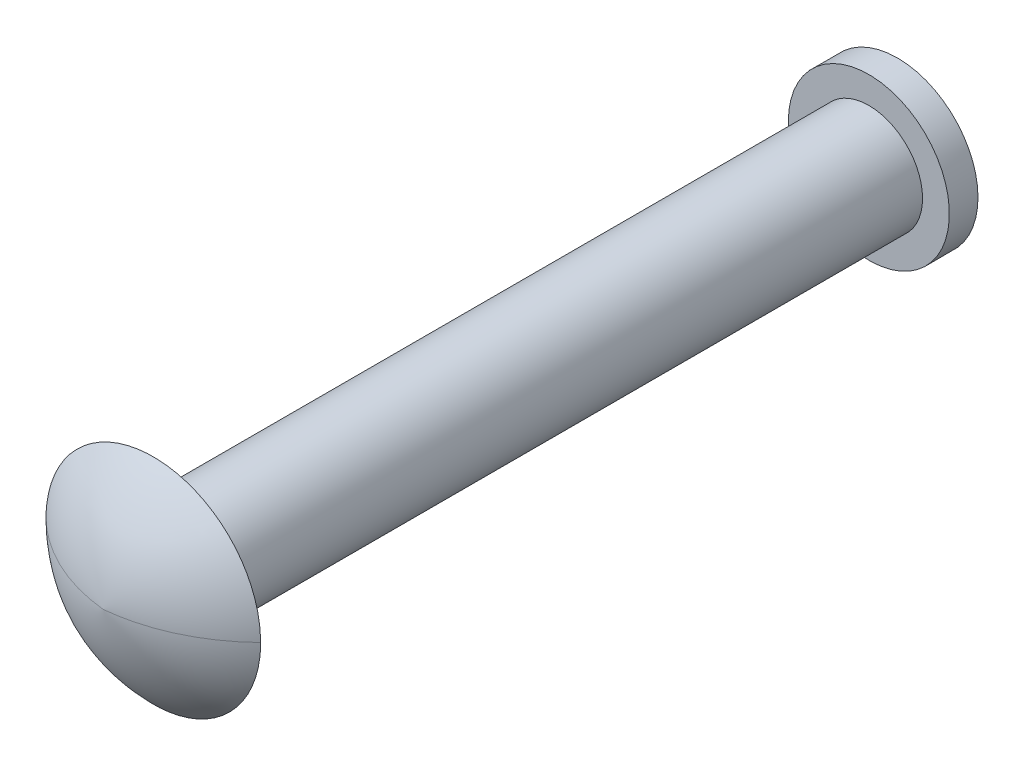
ISO-10303-21;
HEADER;
FILE_DESCRIPTION(('STEP AP214'),'2;1');
FILE_NAME('part.step','',(''),(''),'','','');
FILE_SCHEMA(('AUTOMOTIVE_DESIGN { 1 0 10303 214 1 1 1 1 }'));
ENDSEC;
DATA;
#1=APPLICATION_CONTEXT('core data for automotive mechanical design processes');
#2=APPLICATION_PROTOCOL_DEFINITION('international standard','automotive_design',2000,#1);
#3=PRODUCT_CONTEXT('',#1,'mechanical');
#4=PRODUCT('Part','Part','',(#3));
#5=PRODUCT_RELATED_PRODUCT_CATEGORY('part','',(#4));
#6=PRODUCT_DEFINITION_FORMATION('','',#4);
#7=PRODUCT_DEFINITION_CONTEXT('part definition',#1,'design');
#8=PRODUCT_DEFINITION('design','',#6,#7);
#9=PRODUCT_DEFINITION_SHAPE('','',#8);
#10=(LENGTH_UNIT() NAMED_UNIT(*) SI_UNIT(.MILLI.,.METRE.));
#11=(NAMED_UNIT(*) PLANE_ANGLE_UNIT() SI_UNIT($,.RADIAN.));
#12=(NAMED_UNIT(*) SI_UNIT($,.STERADIAN.) SOLID_ANGLE_UNIT());
#13=UNCERTAINTY_MEASURE_WITH_UNIT(LENGTH_MEASURE(1.E-05),#10,'distance_accuracy_value','');
#14=(GEOMETRIC_REPRESENTATION_CONTEXT(3) GLOBAL_UNCERTAINTY_ASSIGNED_CONTEXT((#13)) GLOBAL_UNIT_ASSIGNED_CONTEXT((#10,
#11,#12)) REPRESENTATION_CONTEXT('',''));
#15=CARTESIAN_POINT('',(0.,0.,0.));
#16=DIRECTION('',(0.,0.,1.));
#17=DIRECTION('',(1.,0.,0.));
#18=AXIS2_PLACEMENT_3D('',#15,#16,#17);
#19=CARTESIAN_POINT('',(-2.25,-2.25,-10.8));
#20=DIRECTION('',(0.,0.,-1.));
#21=DIRECTION('',(0.,1.,0.));
#22=AXIS2_PLACEMENT_3D('',#19,#20,#21);
#23=PLANE('',#22);
#24=CARTESIAN_POINT('',(0.,0.,-10.8));
#25=DIRECTION('',(0.,0.,-1.));
#26=DIRECTION('',(1.,0.,0.));
#27=AXIS2_PLACEMENT_3D('',#24,#25,#26);
#28=CIRCLE('',#27,2.25);
#29=CARTESIAN_POINT('',(2.25,0.,-10.8));
#30=VERTEX_POINT('',#29);
#31=EDGE_CURVE('E151',#30,#30,#28,.F.);
#32=ORIENTED_EDGE('',*,*,#31,.F.);
#33=EDGE_LOOP('',(#32));
#34=FACE_BOUND('',#33,.T.);
#35=ADVANCED_FACE('F17',(#34),#23,.T.);
#36=CARTESIAN_POINT('',(2.25,-2.25,-10.));
#37=DIRECTION('',(0.,0.,1.));
#38=DIRECTION('',(0.,1.,0.));
#39=AXIS2_PLACEMENT_3D('',#36,#37,#38);
#40=PLANE('',#39);
#41=CARTESIAN_POINT('',(0.,0.,-10.));
#42=DIRECTION('',(0.,0.,1.));
#43=DIRECTION('',(-1.,0.,0.));
#44=AXIS2_PLACEMENT_3D('',#41,#42,#43);
#45=CIRCLE('',#44,2.25);
#46=CARTESIAN_POINT('',(-2.25,0.,-10.));
#47=VERTEX_POINT('',#46);
#48=EDGE_CURVE('E153',#47,#47,#45,.T.);
#49=ORIENTED_EDGE('',*,*,#48,.T.);
#50=EDGE_LOOP('',(#49));
#51=FACE_BOUND('',#50,.T.);
#52=CARTESIAN_POINT('',(0.,0.,-10.));
#53=DIRECTION('',(0.,0.,-1.));
#54=DIRECTION('',(1.,0.,0.));
#55=AXIS2_PLACEMENT_3D('',#52,#53,#54);
#56=CIRCLE('',#55,1.5);
#57=CARTESIAN_POINT('',(1.5,0.,-10.));
#58=VERTEX_POINT('',#57);
#59=EDGE_CURVE('E55',#58,#58,#56,.F.);
#60=ORIENTED_EDGE('',*,*,#59,.F.);
#61=EDGE_LOOP('',(#60));
#62=FACE_BOUND('',#61,.T.);
#63=ADVANCED_FACE('F125',(#51,#62),#40,.T.);
#64=CARTESIAN_POINT('',(-3.,-3.,10.));
#65=DIRECTION('',(0.,0.,-1.));
#66=DIRECTION('',(0.,1.,0.));
#67=AXIS2_PLACEMENT_3D('',#64,#65,#66);
#68=PLANE('',#67);
#69=CARTESIAN_POINT('',(3.,0.,10.));
#70=CARTESIAN_POINT('',(3.00000020284646,0.0491468463204253,10.));
#71=CARTESIAN_POINT('',(2.99880764241094,0.0982935130380294,10.));
#72=CARTESIAN_POINT('',(2.99404098853956,0.196565765477887,10.));
#73=CARTESIAN_POINT('',(2.99046233086989,0.245691129895635,10.));
#74=CARTESIAN_POINT('',(2.98092156761264,0.343771929240707,10.));
#75=CARTESIAN_POINT('',(2.97495648556987,0.392727074660294,10.));
#76=CARTESIAN_POINT('',(2.96064909919153,0.490323435182134,10.));
#77=CARTESIAN_POINT('',(2.95230515267095,0.538964409601162,10.));
#78=CARTESIAN_POINT('',(2.9332537469775,0.635793167089272,10.));
#79=CARTESIAN_POINT('',(2.92254573702436,0.683980841816246,10.));
#80=CARTESIAN_POINT('',(2.89878724086213,0.779768551579843,10.));
#81=CARTESIAN_POINT('',(2.88573706641552,0.827368663925969,10.));
#82=CARTESIAN_POINT('',(2.85732230922858,0.921851633698927,10.));
#83=CARTESIAN_POINT('',(2.84195868853992,0.96873478039177,10.));
#84=CARTESIAN_POINT('',(2.80895187640743,1.06165906703895,10.));
#85=CARTESIAN_POINT('',(2.79131010424928,1.10770071103127,10.));
#86=CARTESIAN_POINT('',(2.75378832181262,1.19882212692325,10.));
#87=CARTESIAN_POINT('',(2.73391001645548,1.24390260075932,10.));
#88=CARTESIAN_POINT('',(2.69196272109963,1.33298671744783,10.));
#89=CARTESIAN_POINT('',(2.66989557328385,1.37699122761831,10.));
#90=CARTESIAN_POINT('',(2.62362409058598,1.46381338002381,10.));
#91=CARTESIAN_POINT('',(2.59942161113841,1.50663201099821,10.));
#92=CARTESIAN_POINT('',(2.54893862919822,1.59097730112834,10.));
#93=CARTESIAN_POINT('',(2.52265989615926,1.63250501926406,10.));
#94=CARTESIAN_POINT('',(2.46808895950898,1.71416831959704,10.));
#95=CARTESIAN_POINT('',(2.43979836455643,1.75430497670765,10.));
#96=CARTESIAN_POINT('',(2.3812733675554,1.83309093308115,10.));
#97=CARTESIAN_POINT('',(2.35104036185058,1.87174126956219,10.));
#98=CARTESIAN_POINT('',(2.28870504171117,1.94746430350281,10.));
#99=CARTESIAN_POINT('',(2.25660388124789,1.98453795090202,10.));
#100=CARTESIAN_POINT('',(2.19061131079851,2.05702226133107,10.));
#101=CARTESIAN_POINT('',(2.15672080138521,2.09243374428514,10.));
#102=CARTESIAN_POINT('',(2.08723288170225,2.16151330856904,10.));
#103=CARTESIAN_POINT('',(2.05163612371979,2.1951820460606,10.));
#104=CARTESIAN_POINT('',(1.97882307675932,2.26070062040195,10.));
#105=CARTESIAN_POINT('',(1.94160720984529,2.29255092632776,10.));
#106=CARTESIAN_POINT('',(1.86564707120101,2.35436204552287,10.));
#107=CARTESIAN_POINT('',(1.82690301900757,2.38432312859965,10.));
#108=CARTESIAN_POINT('',(1.74798113090909,2.44229010521479,10.));
#109=CARTESIAN_POINT('',(1.7078033460673,2.4702960682811,10.));
#110=CARTESIAN_POINT('',(1.62611185071513,2.52429199132167,10.));
#111=CARTESIAN_POINT('',(1.58459806011786,2.55028183011964,10.));
#112=CARTESIAN_POINT('',(1.50033539342938,2.60018956328296,10.));
#113=CARTESIAN_POINT('',(1.45758634391866,2.62410716482126,10.));
#114=CARTESIAN_POINT('',(1.3709567297361,2.66981934443358,10.));
#115=CARTESIAN_POINT('',(1.3270759342525,2.69161348504258,10.));
#116=CARTESIAN_POINT('',(1.23828887904027,2.73303251778442,9.99999999999999));
#117=CARTESIAN_POINT('',(1.19338236326412,2.75265686097618,9.99999999999999));
#118=CARTESIAN_POINT('',(1.1026521513009,2.78969492149854,10.));
#119=CARTESIAN_POINT('',(1.0568282007898,2.80710801573956,10.));
#120=CARTESIAN_POINT('',(0.96437338984183,2.8396870442669,10.));
#121=CARTESIAN_POINT('',(0.917742297647335,2.85485232076168,10.));
#122=CARTESIAN_POINT('',(0.823785215093992,2.88290402076812,10.));
#123=CARTESIAN_POINT('',(0.776459029823575,2.89578979133897,9.99999999999999));
#124=CARTESIAN_POINT('',(0.681225269194332,2.91925562737246,9.99999999999999));
#125=CARTESIAN_POINT('',(0.633317543472669,2.92983508250641,10.));
#126=CARTESIAN_POINT('',(0.53703546134663,2.94866627822327,10.));
#127=CARTESIAN_POINT('',(0.488661000622414,2.95691748534247,10.));
#128=CARTESIAN_POINT('',(0.391561213836587,2.97107502180271,10.));
#129=CARTESIAN_POINT('',(0.34283582547708,2.97698092380141,10.));
#130=CARTESIAN_POINT('',(0.24515070858709,2.98643553806352,10.));
#131=CARTESIAN_POINT('',(0.196190951201238,2.98998395214296,10.));
#132=CARTESIAN_POINT('',(0.0981541341374786,2.99471613618716,10.));
#133=CARTESIAN_POINT('',(0.0490770670687403,2.99589975300985,10.));
#134=CARTESIAN_POINT('',(-0.0490770670687369,2.99589975300985,10.));
#135=CARTESIAN_POINT('',(-0.0981541341374756,2.99471613618716,10.));
#136=CARTESIAN_POINT('',(-0.196190951201236,2.98998395214296,10.));
#137=CARTESIAN_POINT('',(-0.245150708587088,2.98643553806352,10.));
#138=CARTESIAN_POINT('',(-0.342835825477078,2.97698092380142,10.));
#139=CARTESIAN_POINT('',(-0.391561213836583,2.97107502180271,10.));
#140=CARTESIAN_POINT('',(-0.488661000622411,2.95691748534247,10.));
#141=CARTESIAN_POINT('',(-0.537035461346627,2.94866627822327,10.));
#142=CARTESIAN_POINT('',(-0.633317543472667,2.92983508250641,10.));
#143=CARTESIAN_POINT('',(-0.68122526919433,2.91925562737246,10.));
#144=CARTESIAN_POINT('',(-0.776459029823573,2.89578979133897,10.));
#145=CARTESIAN_POINT('',(-0.823785215093989,2.88290402076812,10.));
#146=CARTESIAN_POINT('',(-0.917742297647332,2.85485232076168,10.));
#147=CARTESIAN_POINT('',(-0.964373389841827,2.8396870442669,10.));
#148=CARTESIAN_POINT('',(-1.0568282007898,2.80710801573956,10.));
#149=CARTESIAN_POINT('',(-1.1026521513009,2.78969492149854,10.));
#150=CARTESIAN_POINT('',(-1.19338236326412,2.75265686097618,10.));
#151=CARTESIAN_POINT('',(-1.23828887904027,2.73303251778442,10.));
#152=CARTESIAN_POINT('',(-1.32707593425249,2.69161348504258,10.));
#153=CARTESIAN_POINT('',(-1.3709567297361,2.66981934443358,10.));
#154=CARTESIAN_POINT('',(-1.45758634391866,2.62410716482126,10.));
#155=CARTESIAN_POINT('',(-1.50033539342938,2.60018956328296,10.));
#156=CARTESIAN_POINT('',(-1.58459806011786,2.55028183011964,10.));
#157=CARTESIAN_POINT('',(-1.62611185071513,2.52429199132167,10.));
#158=CARTESIAN_POINT('',(-1.7078033460673,2.4702960682811,10.));
#159=CARTESIAN_POINT('',(-1.74798113090909,2.44229010521479,10.));
#160=CARTESIAN_POINT('',(-1.82690301900757,2.38432312859965,10.));
#161=CARTESIAN_POINT('',(-1.865647071201,2.35436204552287,10.));
#162=CARTESIAN_POINT('',(-1.94160720984529,2.29255092632776,10.));
#163=CARTESIAN_POINT('',(-1.97882307675932,2.26070062040194,10.));
#164=CARTESIAN_POINT('',(-2.05163612371979,2.1951820460606,10.));
#165=CARTESIAN_POINT('',(-2.08723288170225,2.16151330856904,10.));
#166=CARTESIAN_POINT('',(-2.15672080138521,2.09243374428513,10.));
#167=CARTESIAN_POINT('',(-2.19061131079851,2.05702226133107,10.));
#168=CARTESIAN_POINT('',(-2.25660388124789,1.98453795090201,10.));
#169=CARTESIAN_POINT('',(-2.28870504171117,1.94746430350281,10.));
#170=CARTESIAN_POINT('',(-2.35104036185057,1.87174126956219,10.));
#171=CARTESIAN_POINT('',(-2.3812733675554,1.83309093308115,10.));
#172=CARTESIAN_POINT('',(-2.43979836455643,1.75430497670765,10.));
#173=CARTESIAN_POINT('',(-2.46808895950897,1.71416831959704,10.));
#174=CARTESIAN_POINT('',(-2.52265989615926,1.63250501926406,10.));
#175=CARTESIAN_POINT('',(-2.54893862919822,1.59097730112833,10.));
#176=CARTESIAN_POINT('',(-2.59942161113841,1.5066320109982,10.));
#177=CARTESIAN_POINT('',(-2.62362409058598,1.46381338002381,9.99999999999999));
#178=CARTESIAN_POINT('',(-2.66989557328385,1.3769912276183,9.99999999999999));
#179=CARTESIAN_POINT('',(-2.69196272109963,1.33298671744783,10.));
#180=CARTESIAN_POINT('',(-2.73391001645548,1.24390260075932,10.));
#181=CARTESIAN_POINT('',(-2.75378832181262,1.19882212692325,10.));
#182=CARTESIAN_POINT('',(-2.79131010424928,1.10770071103127,10.));
#183=CARTESIAN_POINT('',(-2.80895187640743,1.06165906703894,10.));
#184=CARTESIAN_POINT('',(-2.84195868853992,0.968734780391763,10.));
#185=CARTESIAN_POINT('',(-2.85732230922858,0.92185163369892,10.));
#186=CARTESIAN_POINT('',(-2.88573706641552,0.827368663925962,10.));
#187=CARTESIAN_POINT('',(-2.89878724086213,0.779768551579836,10.));
#188=CARTESIAN_POINT('',(-2.92254573702436,0.683980841816238,10.));
#189=CARTESIAN_POINT('',(-2.9332537469775,0.635793167089264,10.));
#190=CARTESIAN_POINT('',(-2.95230515267095,0.538964409601153,10.));
#191=CARTESIAN_POINT('',(-2.96064909919153,0.490323435182125,10.));
#192=CARTESIAN_POINT('',(-2.97495648556987,0.392727074660285,10.));
#193=CARTESIAN_POINT('',(-2.98092156761264,0.343771929240698,10.));
#194=CARTESIAN_POINT('',(-2.99046233086989,0.245691129895626,10.));
#195=CARTESIAN_POINT('',(-2.99404098853956,0.196565765477879,10.));
#196=CARTESIAN_POINT('',(-2.99880764241094,0.0982935130380203,10.));
#197=CARTESIAN_POINT('',(-3.00000020284646,0.0491468463204161,10.));
#198=CARTESIAN_POINT('',(-2.99999999999999,0.,10.));
#199=B_SPLINE_CURVE_WITH_KNOTS('',3,(#69,#70,#71,#72,#73,#74,#75,#76,#77,#78,#79,#80,#81,#82,
#83,#84,#85,#86,#87,#88,#89,#90,#91,#92,#93,#94,#95,#96,#97,#98,#99,#100,#101,#102,#103,#104,
#105,#106,#107,#108,#109,#110,#111,#112,#113,#114,#115,#116,#117,#118,#119,#120,#121,#122,#123,
#124,#125,#126,#127,#128,#129,#130,#131,#132,#133,#134,#135,#136,#137,#138,#139,#140,#141,#142,
#143,#144,#145,#146,#147,#148,#149,#150,#151,#152,#153,#154,#155,#156,#157,#158,#159,#160,#161,
#162,#163,#164,#165,#166,#167,#168,#169,#170,#171,#172,#173,#174,#175,#176,#177,#178,#179,#180,
#181,#182,#183,#184,#185,#186,#187,#188,#189,#190,#191,#192,#193,#194,#195,#196,#197,#198),
.UNSPECIFIED.,.F.,.F.,(4,2,2,2,2,2,2,2,2,2,2,2,2,2,2,2,2,2,2,2,2,2,2,2,2,2,2,2,2,2,2,2,2,2,2,2,
2,2,2,2,2,2,2,2,2,2,2,2,2,2,2,2,2,2,2,2,2,2,2,2,2,2,2,2,4),(0.,0.147425867713881,
0.295134550379822,0.443028039153769,0.591023870449802,0.739054218317639,0.887064876652057,
1.03501415355226,1.18287169893794,1.33061728577323,1.47823956472878,1.62573481164507,
1.77310568660213,1.92036002264679,2.06750966120472,2.21456934987737,2.36155571668913,
2.5084863329349,2.65537887463318,2.80225039028237,2.94911668022552,3.09599179053082,
3.24288762196673,3.38981365245681,3.53677676939175,3.68378120638939,3.83082857754813,
3.97791800093872,4.1250463020159,4.27220828678662,4.41939707392065,4.5666044745048,
4.7138214077949,4.86103834108501,5.00824574166916,5.15543452880319,5.3025965135739,
5.44972481465109,5.59681423804168,5.74386160920042,5.89086604619806,6.037829163133,
6.18475519362308,6.33165102505899,6.4785261353643,6.62539242530745,6.77226394095663,
6.91915648265491,7.06608709890068,7.21307346571245,7.36013315438509,7.50728279294302,
7.65453712898768,7.80190800394474,7.94940325086103,8.09702552981659,8.24477111665187,
8.39262866203756,8.54057793893776,8.68858859727218,8.83661894514002,8.98461477643605,
9.13250826521,9.28021694787594,9.42764281558982),.UNSPECIFIED.);
#200=CARTESIAN_POINT('',(3.,0.,10.));
#201=VERTEX_POINT('',#200);
#202=CARTESIAN_POINT('',(-3.,0.,10.));
#203=VERTEX_POINT('',#202);
#204=EDGE_CURVE('E42',#201,#203,#199,.T.);
#205=ORIENTED_EDGE('',*,*,#204,.F.);
#206=CARTESIAN_POINT('',(-3.,0.,10.));
#207=CARTESIAN_POINT('',(-3.00000020284646,-0.049146846320425,10.));
#208=CARTESIAN_POINT('',(-2.99880764241094,-0.0982935130380291,10.));
#209=CARTESIAN_POINT('',(-2.99404098853956,-0.196565765477887,10.));
#210=CARTESIAN_POINT('',(-2.99046233086989,-0.245691129895635,10.));
#211=CARTESIAN_POINT('',(-2.98092156761264,-0.343771929240707,10.));
#212=CARTESIAN_POINT('',(-2.97495648556987,-0.392727074660294,10.));
#213=CARTESIAN_POINT('',(-2.96064909919153,-0.490323435182133,10.));
#214=CARTESIAN_POINT('',(-2.95230515267095,-0.538964409601161,10.));
#215=CARTESIAN_POINT('',(-2.9332537469775,-0.635793167089272,10.));
#216=CARTESIAN_POINT('',(-2.92254573702436,-0.683980841816245,10.));
#217=CARTESIAN_POINT('',(-2.89878724086213,-0.779768551579843,10.));
#218=CARTESIAN_POINT('',(-2.88573706641552,-0.827368663925968,10.));
#219=CARTESIAN_POINT('',(-2.85732230922858,-0.921851633698927,10.));
#220=CARTESIAN_POINT('',(-2.84195868853992,-0.96873478039177,10.));
#221=CARTESIAN_POINT('',(-2.80895187640743,-1.06165906703895,10.));
#222=CARTESIAN_POINT('',(-2.79131010424928,-1.10770071103127,10.));
#223=CARTESIAN_POINT('',(-2.75378832181262,-1.19882212692325,10.));
#224=CARTESIAN_POINT('',(-2.73391001645548,-1.24390260075932,10.));
#225=CARTESIAN_POINT('',(-2.69196272109963,-1.33298671744783,10.));
#226=CARTESIAN_POINT('',(-2.66989557328385,-1.37699122761831,10.));
#227=CARTESIAN_POINT('',(-2.62362409058598,-1.46381338002381,10.));
#228=CARTESIAN_POINT('',(-2.59942161113841,-1.50663201099821,10.));
#229=CARTESIAN_POINT('',(-2.54893862919822,-1.59097730112834,10.));
#230=CARTESIAN_POINT('',(-2.52265989615926,-1.63250501926406,10.));
#231=CARTESIAN_POINT('',(-2.46808895950898,-1.71416831959704,10.));
#232=CARTESIAN_POINT('',(-2.43979836455643,-1.75430497670765,10.));
#233=CARTESIAN_POINT('',(-2.3812733675554,-1.83309093308115,10.));
#234=CARTESIAN_POINT('',(-2.35104036185058,-1.87174126956219,10.));
#235=CARTESIAN_POINT('',(-2.28870504171117,-1.94746430350281,10.));
#236=CARTESIAN_POINT('',(-2.25660388124789,-1.98453795090202,10.));
#237=CARTESIAN_POINT('',(-2.19061131079851,-2.05702226133108,10.));
#238=CARTESIAN_POINT('',(-2.15672080138521,-2.09243374428514,10.));
#239=CARTESIAN_POINT('',(-2.08723288170225,-2.16151330856904,10.));
#240=CARTESIAN_POINT('',(-2.05163612371979,-2.1951820460606,10.));
#241=CARTESIAN_POINT('',(-1.97882307675932,-2.26070062040194,10.));
#242=CARTESIAN_POINT('',(-1.94160720984529,-2.29255092632776,10.));
#243=CARTESIAN_POINT('',(-1.86564707120101,-2.35436204552287,10.));
#244=CARTESIAN_POINT('',(-1.82690301900757,-2.38432312859965,10.));
#245=CARTESIAN_POINT('',(-1.74798113090909,-2.44229010521479,10.));
#246=CARTESIAN_POINT('',(-1.7078033460673,-2.4702960682811,10.));
#247=CARTESIAN_POINT('',(-1.62611185071513,-2.52429199132167,10.));
#248=CARTESIAN_POINT('',(-1.58459806011786,-2.55028183011964,10.));
#249=CARTESIAN_POINT('',(-1.50033539342938,-2.60018956328297,10.));
#250=CARTESIAN_POINT('',(-1.45758634391866,-2.62410716482126,10.));
#251=CARTESIAN_POINT('',(-1.3709567297361,-2.66981934443358,10.));
#252=CARTESIAN_POINT('',(-1.3270759342525,-2.69161348504258,10.));
#253=CARTESIAN_POINT('',(-1.23828887904027,-2.73303251778442,9.99999999999999));
#254=CARTESIAN_POINT('',(-1.19338236326412,-2.75265686097619,9.99999999999999));
#255=CARTESIAN_POINT('',(-1.1026521513009,-2.78969492149854,9.99999999999999));
#256=CARTESIAN_POINT('',(-1.0568282007898,-2.80710801573956,10.));
#257=CARTESIAN_POINT('',(-0.96437338984183,-2.8396870442669,10.));
#258=CARTESIAN_POINT('',(-0.917742297647336,-2.85485232076168,10.));
#259=CARTESIAN_POINT('',(-0.823785215093992,-2.88290402076812,10.));
#260=CARTESIAN_POINT('',(-0.776459029823575,-2.89578979133897,9.99999999999999));
#261=CARTESIAN_POINT('',(-0.681225269194333,-2.91925562737246,9.99999999999999));
#262=CARTESIAN_POINT('',(-0.633317543472671,-2.92983508250641,10.));
#263=CARTESIAN_POINT('',(-0.537035461346631,-2.94866627822327,10.));
#264=CARTESIAN_POINT('',(-0.488661000622415,-2.95691748534247,10.));
#265=CARTESIAN_POINT('',(-0.391561213836587,-2.97107502180271,10.));
#266=CARTESIAN_POINT('',(-0.342835825477081,-2.97698092380142,10.));
#267=CARTESIAN_POINT('',(-0.245150708587091,-2.98643553806352,10.));
#268=CARTESIAN_POINT('',(-0.19619095120124,-2.98998395214296,10.));
#269=CARTESIAN_POINT('',(-0.0981541341374798,-2.99471613618716,10.));
#270=CARTESIAN_POINT('',(-0.0490770670687411,-2.99589975300985,10.));
#271=CARTESIAN_POINT('',(0.0490770670687364,-2.99589975300985,10.));
#272=CARTESIAN_POINT('',(0.0981541341374752,-2.99471613618716,10.));
#273=CARTESIAN_POINT('',(0.196190951201235,-2.98998395214296,10.));
#274=CARTESIAN_POINT('',(0.245150708587087,-2.98643553806352,10.));
#275=CARTESIAN_POINT('',(0.342835825477076,-2.97698092380142,10.));
#276=CARTESIAN_POINT('',(0.391561213836582,-2.97107502180271,10.));
#277=CARTESIAN_POINT('',(0.488661000622411,-2.95691748534247,10.));
#278=CARTESIAN_POINT('',(0.537035461346627,-2.94866627822327,10.));
#279=CARTESIAN_POINT('',(0.633317543472666,-2.92983508250641,10.));
#280=CARTESIAN_POINT('',(0.681225269194329,-2.91925562737246,10.));
#281=CARTESIAN_POINT('',(0.776459029823572,-2.89578979133897,10.));
#282=CARTESIAN_POINT('',(0.823785215093989,-2.88290402076812,10.));
#283=CARTESIAN_POINT('',(0.917742297647332,-2.85485232076168,10.));
#284=CARTESIAN_POINT('',(0.964373389841826,-2.8396870442669,10.));
#285=CARTESIAN_POINT('',(1.0568282007898,-2.80710801573956,10.));
#286=CARTESIAN_POINT('',(1.10265215130089,-2.78969492149854,10.));
#287=CARTESIAN_POINT('',(1.19338236326412,-2.75265686097619,10.));
#288=CARTESIAN_POINT('',(1.23828887904027,-2.73303251778442,10.));
#289=CARTESIAN_POINT('',(1.32707593425249,-2.69161348504258,10.));
#290=CARTESIAN_POINT('',(1.3709567297361,-2.66981934443358,10.));
#291=CARTESIAN_POINT('',(1.45758634391866,-2.62410716482126,10.));
#292=CARTESIAN_POINT('',(1.50033539342938,-2.60018956328297,10.));
#293=CARTESIAN_POINT('',(1.58459806011786,-2.55028183011964,10.));
#294=CARTESIAN_POINT('',(1.62611185071513,-2.52429199132167,10.));
#295=CARTESIAN_POINT('',(1.7078033460673,-2.4702960682811,10.));
#296=CARTESIAN_POINT('',(1.74798113090909,-2.44229010521479,10.));
#297=CARTESIAN_POINT('',(1.82690301900757,-2.38432312859965,10.));
#298=CARTESIAN_POINT('',(1.86564707120101,-2.35436204552287,10.));
#299=CARTESIAN_POINT('',(1.94160720984529,-2.29255092632776,10.));
#300=CARTESIAN_POINT('',(1.97882307675932,-2.26070062040194,10.));
#301=CARTESIAN_POINT('',(2.05163612371979,-2.1951820460606,10.));
#302=CARTESIAN_POINT('',(2.08723288170225,-2.16151330856904,10.));
#303=CARTESIAN_POINT('',(2.15672080138522,-2.09243374428514,10.));
#304=CARTESIAN_POINT('',(2.19061131079851,-2.05702226133107,10.));
#305=CARTESIAN_POINT('',(2.25660388124789,-1.98453795090201,10.));
#306=CARTESIAN_POINT('',(2.28870504171117,-1.94746430350281,10.));
#307=CARTESIAN_POINT('',(2.35104036185058,-1.87174126956219,10.));
#308=CARTESIAN_POINT('',(2.3812733675554,-1.83309093308115,10.));
#309=CARTESIAN_POINT('',(2.43979836455643,-1.75430497670765,10.));
#310=CARTESIAN_POINT('',(2.46808895950898,-1.71416831959704,10.));
#311=CARTESIAN_POINT('',(2.52265989615926,-1.63250501926406,10.));
#312=CARTESIAN_POINT('',(2.54893862919822,-1.59097730112833,10.));
#313=CARTESIAN_POINT('',(2.59942161113841,-1.5066320109982,10.));
#314=CARTESIAN_POINT('',(2.62362409058598,-1.46381338002381,9.99999999999999));
#315=CARTESIAN_POINT('',(2.66989557328385,-1.3769912276183,9.99999999999999));
#316=CARTESIAN_POINT('',(2.69196272109963,-1.33298671744783,10.));
#317=CARTESIAN_POINT('',(2.73391001645548,-1.24390260075932,10.));
#318=CARTESIAN_POINT('',(2.75378832181263,-1.19882212692325,10.));
#319=CARTESIAN_POINT('',(2.79131010424928,-1.10770071103127,10.));
#320=CARTESIAN_POINT('',(2.80895187640743,-1.06165906703894,10.));
#321=CARTESIAN_POINT('',(2.84195868853992,-0.968734780391764,10.));
#322=CARTESIAN_POINT('',(2.85732230922858,-0.921851633698921,10.));
#323=CARTESIAN_POINT('',(2.88573706641552,-0.827368663925962,10.));
#324=CARTESIAN_POINT('',(2.89878724086214,-0.779768551579837,10.));
#325=CARTESIAN_POINT('',(2.92254573702436,-0.683980841816239,10.));
#326=CARTESIAN_POINT('',(2.9332537469775,-0.635793167089266,10.));
#327=CARTESIAN_POINT('',(2.95230515267095,-0.538964409601154,10.));
#328=CARTESIAN_POINT('',(2.96064909919153,-0.490323435182126,10.));
#329=CARTESIAN_POINT('',(2.97495648556987,-0.392727074660287,10.));
#330=CARTESIAN_POINT('',(2.98092156761264,-0.343771929240699,10.));
#331=CARTESIAN_POINT('',(2.9904623308699,-0.245691129895628,10.));
#332=CARTESIAN_POINT('',(2.99404098853956,-0.19656576547788,10.));
#333=CARTESIAN_POINT('',(2.99880764241094,-0.0982935130380218,10.));
#334=CARTESIAN_POINT('',(3.00000020284646,-0.0491468463204176,10.));
#335=CARTESIAN_POINT('',(3.,0.,10.));
#336=B_SPLINE_CURVE_WITH_KNOTS('',3,(#206,#207,#208,#209,#210,#211,#212,#213,#214,#215,#216,
#217,#218,#219,#220,#221,#222,#223,#224,#225,#226,#227,#228,#229,#230,#231,#232,#233,#234,#235,
#236,#237,#238,#239,#240,#241,#242,#243,#244,#245,#246,#247,#248,#249,#250,#251,#252,#253,#254,
#255,#256,#257,#258,#259,#260,#261,#262,#263,#264,#265,#266,#267,#268,#269,#270,#271,#272,#273,
#274,#275,#276,#277,#278,#279,#280,#281,#282,#283,#284,#285,#286,#287,#288,#289,#290,#291,#292,
#293,#294,#295,#296,#297,#298,#299,#300,#301,#302,#303,#304,#305,#306,#307,#308,#309,#310,#311,
#312,#313,#314,#315,#316,#317,#318,#319,#320,#321,#322,#323,#324,#325,#326,#327,#328,#329,#330,
#331,#332,#333,#334,#335),.UNSPECIFIED.,.F.,.F.,(4,2,2,2,2,2,2,2,2,2,2,2,2,2,2,2,2,2,2,2,2,2,2,
2,2,2,2,2,2,2,2,2,2,2,2,2,2,2,2,2,2,2,2,2,2,2,2,2,2,2,2,2,2,2,2,2,2,2,2,2,2,2,2,2,4),(0.,
0.147425867713881,0.295134550379822,0.443028039153769,0.591023870449802,0.739054218317639,
0.887064876652057,1.03501415355226,1.18287169893794,1.33061728577323,1.47823956472879,
1.62573481164507,1.77310568660213,1.92036002264679,2.06750966120472,2.21456934987737,
2.36155571668913,2.5084863329349,2.65537887463318,2.80225039028237,2.94911668022552,
3.09599179053082,3.24288762196673,3.38981365245681,3.53677676939175,3.68378120638939,
3.83082857754813,3.97791800093872,4.1250463020159,4.27220828678662,4.41939707392065,
4.5666044745048,4.7138214077949,4.86103834108501,5.00824574166916,5.15543452880319,
5.3025965135739,5.44972481465109,5.59681423804168,5.74386160920042,5.89086604619806,
6.037829163133,6.18475519362308,6.33165102505899,6.4785261353643,6.62539242530745,
6.77226394095663,6.91915648265491,7.06608709890068,7.21307346571245,7.36013315438509,
7.50728279294302,7.65453712898768,7.80190800394474,7.94940325086103,8.09702552981659,
8.24477111665187,8.39262866203756,8.54057793893776,8.68858859727218,8.83661894514002,
8.98461477643605,9.13250826521,9.28021694787594,9.42764281558982),.UNSPECIFIED.);
#337=EDGE_CURVE('E53',#203,#201,#336,.T.);
#338=ORIENTED_EDGE('',*,*,#337,.F.);
#339=EDGE_LOOP('',(#205,#338));
#340=FACE_BOUND('',#339,.T.);
#341=CARTESIAN_POINT('',(0.,0.,10.));
#342=DIRECTION('',(0.,0.,1.));
#343=DIRECTION('',(-1.,0.,0.));
#344=AXIS2_PLACEMENT_3D('',#341,#342,#343);
#345=CIRCLE('',#344,1.5);
#346=CARTESIAN_POINT('',(-1.5,0.,10.));
#347=VERTEX_POINT('',#346);
#348=EDGE_CURVE('E46',#347,#347,#345,.T.);
#349=ORIENTED_EDGE('',*,*,#348,.T.);
#350=EDGE_LOOP('',(#349));
#351=FACE_BOUND('',#350,.T.);
#352=ADVANCED_FACE('F51',(#340,#351),#68,.T.);
#353=CARTESIAN_POINT('',(0.,0.,11.4));
#354=DIRECTION('',(0.,0.,1.));
#355=DIRECTION('',(-1.,0.,0.));
#356=AXIS2_PLACEMENT_3D('',#353,#354,#355);
#357=CYLINDRICAL_SURFACE('',#356,2.25);
#358=ORIENTED_EDGE('',*,*,#48,.F.);
#359=EDGE_LOOP('',(#358));
#360=FACE_BOUND('',#359,.T.);
#361=ORIENTED_EDGE('',*,*,#31,.T.);
#362=EDGE_LOOP('',(#361));
#363=FACE_BOUND('',#362,.T.);
#364=ADVANCED_FACE('F117',(#360,#363),#357,.T.);
#365=CARTESIAN_POINT('',(0.,0.,11.4));
#366=DIRECTION('',(0.,0.,1.));
#367=DIRECTION('',(-1.,0.,0.));
#368=AXIS2_PLACEMENT_3D('',#365,#366,#367);
#369=CYLINDRICAL_SURFACE('',#368,1.5);
#370=ORIENTED_EDGE('',*,*,#348,.F.);
#371=EDGE_LOOP('',(#370));
#372=FACE_BOUND('',#371,.T.);
#373=ORIENTED_EDGE('',*,*,#59,.T.);
#374=EDGE_LOOP('',(#373));
#375=FACE_BOUND('',#374,.T.);
#376=ADVANCED_FACE('F77',(#372,#375),#369,.T.);
#377=CARTESIAN_POINT('',(0.,0.,11.4));
#378=CARTESIAN_POINT('',(0.,0.,11.4));
#379=CARTESIAN_POINT('',(0.,0.,11.4));
#380=CARTESIAN_POINT('',(0.,0.,11.4));
#381=CARTESIAN_POINT('',(0.,0.,11.4));
#382=CARTESIAN_POINT('',(0.,0.,11.4));
#383=CARTESIAN_POINT('',(-0.839416517683725,0.,11.3164542865432));
#384=CARTESIAN_POINT('',(-0.839416517683723,-0.527420953051426,11.3164542865432));
#385=CARTESIAN_POINT('',(-0.430430308351795,-1.07752031707485,11.3164542865432));
#386=CARTESIAN_POINT('',(0.430430308351793,-1.07752031707486,11.3164542865432));
#387=CARTESIAN_POINT('',(0.839416517683725,-0.527420953051424,11.3164542865432));
#388=CARTESIAN_POINT('',(0.839416517683725,0.,11.3164542865432));
#389=CARTESIAN_POINT('',(-1.66048773074749,0.,11.0439022801732));
#390=CARTESIAN_POINT('',(-1.66048773074748,-1.04331521125846,11.0439022801732));
#391=CARTESIAN_POINT('',(-0.851453635832916,-2.13149161166265,11.0439022801732));
#392=CARTESIAN_POINT('',(0.851453635832912,-2.13149161166266,11.0439022801732));
#393=CARTESIAN_POINT('',(1.66048773074748,-1.04331521125846,11.0439022801732));
#394=CARTESIAN_POINT('',(1.66048773074749,0.,11.0439022801732));
#395=CARTESIAN_POINT('',(-2.39678136153918,0.,10.5896840260773));
#396=CARTESIAN_POINT('',(-2.39678136153918,-1.5059421435345,10.5896840260773));
#397=CARTESIAN_POINT('',(-1.22900528970512,-3.07663782906147,10.5896840260773));
#398=CARTESIAN_POINT('',(1.22900528970511,-3.07663782906149,10.5896840260773));
#399=CARTESIAN_POINT('',(2.39678136153918,-1.50594214353449,10.5896840260773));
#400=CARTESIAN_POINT('',(2.39678136153918,0.,10.5896840260773));
#401=CARTESIAN_POINT('',(-3.,0.,10.));
#402=CARTESIAN_POINT('',(-2.99999999999999,-1.88495559215388,10.));
#403=CARTESIAN_POINT('',(-1.53831965162963,-3.85096180873881,10.));
#404=CARTESIAN_POINT('',(1.53831965162962,-3.85096180873883,9.99999999999999));
#405=CARTESIAN_POINT('',(3.,-1.88495559215387,10.));
#406=CARTESIAN_POINT('',(3.,0.,10.));
#407=B_SPLINE_SURFACE_WITH_KNOTS('',4,5,((#377,#378,#379,#380,#381,#382),(#383,#384,#385,#386,
#387,#388),(#389,#390,#391,#392,#393,#394),(#395,#396,#397,#398,#399,#400),(#401,#402,#403,#404,
#405,#406)),.UNSPECIFIED.,.F.,.F.,.F.,(5,5),(6,6),(0.,1.),(0.,1.),.UNSPECIFIED.);
#408=CARTESIAN_POINT('',(3.,0.,10.));
#409=CARTESIAN_POINT('',(2.94973027409746,0.,10.049142897198));
#410=CARTESIAN_POINT('',(2.89842243261817,0.,10.097223677055));
#411=CARTESIAN_POINT('',(2.7938231524128,0.,10.1911812057174));
#412=CARTESIAN_POINT('',(2.74053163450665,0.,10.2370578663759));
#413=CARTESIAN_POINT('',(2.63206195647514,0.,10.3265231818407));
#414=CARTESIAN_POINT('',(2.57688380638913,0.,10.3701118488189));
#415=CARTESIAN_POINT('',(2.46474083261661,0.,10.4549228774536));
#416=CARTESIAN_POINT('',(2.4077760678531,0.,10.4961453170223));
#417=CARTESIAN_POINT('',(2.29216188777468,0.,10.5761501294505));
#418=CARTESIAN_POINT('',(2.2335125489839,0.,10.614932612894));
#419=CARTESIAN_POINT('',(2.11463354334852,0.,10.6899885931953));
#420=CARTESIAN_POINT('',(2.05440394814445,0.,10.7262622035221));
#421=CARTESIAN_POINT('',(1.93247097424124,0.,10.7962362742849));
#422=CARTESIAN_POINT('',(1.87076764805679,0.,10.8299368262297));
#423=CARTESIAN_POINT('',(1.74599598847785,0.,10.8947053904853));
#424=CARTESIAN_POINT('',(1.68292768162173,0.,10.9257734539201));
#425=CARTESIAN_POINT('',(1.55553705605033,0.,10.9852224125201));
#426=CARTESIAN_POINT('',(1.49121473733505,0.,11.0136033076852));
#427=CARTESIAN_POINT('',(1.36142929726363,0.,11.0676280565998));
#428=CARTESIAN_POINT('',(1.29596615377139,0.,11.0932718571708));
#429=CARTESIAN_POINT('',(1.16401448126356,0.,11.1417772880665));
#430=CARTESIAN_POINT('',(1.09752591584549,0.,11.1646388193633));
#431=CARTESIAN_POINT('',(0.963641022213748,0.,11.2075393253867));
#432=CARTESIAN_POINT('',(0.896244653052081,0.,11.2275781723211));
#433=CARTESIAN_POINT('',(0.760663973111457,0.,11.2647976279017));
#434=CARTESIAN_POINT('',(0.692479626732612,0.,11.2819781068662));
#435=CARTESIAN_POINT('',(0.555445030392246,0.,11.3134499442841));
#436=CARTESIAN_POINT('',(0.486594758565392,0.,11.3277412075319));
#437=CARTESIAN_POINT('',(0.348352497320356,0.,11.3534081303962));
#438=CARTESIAN_POINT('',(0.278960505021904,0.,11.3647837744998));
#439=CARTESIAN_POINT('',(0.139761401608543,0.,11.3845988248594));
#440=CARTESIAN_POINT('',(0.0699543071913734,0.,11.3930383484209));
#441=CARTESIAN_POINT('',(0.,0.,11.4));
#442=B_SPLINE_CURVE_WITH_KNOTS('',3,(#408,#409,#410,#411,#412,#413,#414,#415,#416,#417,#418,
#419,#420,#421,#422,#423,#424,#425,#426,#427,#428,#429,#430,#431,#432,#433,#434,#435,#436,#437,
#438,#439,#440,#441),.UNSPECIFIED.,.F.,.F.,(4,2,2,2,2,2,2,2,2,2,2,2,2,2,2,2,4),(0.,
0.210883728210085,0.421775883061778,0.632666915863961,0.843551000725272,1.05442552098589,
1.26529049776568,1.47614797179472,1.68700134994458,1.89785472809443,2.10871220212347,
2.31957717890326,2.53045169916388,2.74133578402519,2.95222681682737,3.16311897167907,
3.37400269988915),.UNSPECIFIED.);
#443=CARTESIAN_POINT('',(0.,0.,11.4));
#444=VERTEX_POINT('',#443);
#445=EDGE_CURVE('E30',#201,#444,#442,.T.);
#446=CARTESIAN_POINT('',(0.,0.,11.4));
#447=CARTESIAN_POINT('',(-0.0699543071913735,0.,11.3930383484209));
#448=CARTESIAN_POINT('',(-0.139761401608543,0.,11.3845988248594));
#449=CARTESIAN_POINT('',(-0.278960505021904,0.,11.3647837744998));
#450=CARTESIAN_POINT('',(-0.348352497320356,0.,11.3534081303962));
#451=CARTESIAN_POINT('',(-0.486594758565393,0.,11.3277412075319));
#452=CARTESIAN_POINT('',(-0.555445030392246,0.,11.3134499442841));
#453=CARTESIAN_POINT('',(-0.692479626732613,0.,11.2819781068662));
#454=CARTESIAN_POINT('',(-0.760663973111457,0.,11.2647976279017));
#455=CARTESIAN_POINT('',(-0.896244653052082,0.,11.2275781723211));
#456=CARTESIAN_POINT('',(-0.963641022213749,0.,11.2075393253867));
#457=CARTESIAN_POINT('',(-1.09752591584549,0.,11.1646388193633));
#458=CARTESIAN_POINT('',(-1.16401448126356,0.,11.1417772880665));
#459=CARTESIAN_POINT('',(-1.29596615377139,0.,11.0932718571708));
#460=CARTESIAN_POINT('',(-1.36142929726363,0.,11.0676280565998));
#461=CARTESIAN_POINT('',(-1.49121473733505,0.,11.0136033076852));
#462=CARTESIAN_POINT('',(-1.55553705605033,0.,10.9852224125201));
#463=CARTESIAN_POINT('',(-1.68292768162173,0.,10.9257734539201));
#464=CARTESIAN_POINT('',(-1.74599598847785,0.,10.8947053904853));
#465=CARTESIAN_POINT('',(-1.87076764805679,0.,10.8299368262297));
#466=CARTESIAN_POINT('',(-1.93247097424124,0.,10.7962362742849));
#467=CARTESIAN_POINT('',(-2.05440394814445,0.,10.7262622035221));
#468=CARTESIAN_POINT('',(-2.11463354334852,0.,10.6899885931953));
#469=CARTESIAN_POINT('',(-2.2335125489839,0.,10.614932612894));
#470=CARTESIAN_POINT('',(-2.29216188777468,0.,10.5761501294505));
#471=CARTESIAN_POINT('',(-2.4077760678531,0.,10.4961453170223));
#472=CARTESIAN_POINT('',(-2.46474083261661,0.,10.4549228774536));
#473=CARTESIAN_POINT('',(-2.57688380638913,0.,10.3701118488189));
#474=CARTESIAN_POINT('',(-2.63206195647513,0.,10.3265231818407));
#475=CARTESIAN_POINT('',(-2.74053163450665,0.,10.2370578663759));
#476=CARTESIAN_POINT('',(-2.7938231524128,0.,10.1911812057174));
#477=CARTESIAN_POINT('',(-2.89842243261817,0.,10.0972236770549));
#478=CARTESIAN_POINT('',(-2.94973027409747,0.,10.0491428971981));
#479=CARTESIAN_POINT('',(-3.,0.,10.));
#480=B_SPLINE_CURVE_WITH_KNOTS('',3,(#446,#447,#448,#449,#450,#451,#452,#453,#454,#455,#456,
#457,#458,#459,#460,#461,#462,#463,#464,#465,#466,#467,#468,#469,#470,#471,#472,#473,#474,#475,
#476,#477,#478,#479),.UNSPECIFIED.,.F.,.F.,(4,2,2,2,2,2,2,2,2,2,2,2,2,2,2,2,4),(0.,
0.210883728210083,0.421775883061778,0.632666915863961,0.843551000725272,1.05442552098589,
1.26529049776568,1.47614797179472,1.68700134994457,1.89785472809443,2.10871220212347,
2.31957717890326,2.53045169916388,2.74133578402519,2.95222681682738,3.16311897167907,
3.37400269988915),.UNSPECIFIED.);
#481=EDGE_CURVE('E11',#444,#203,#480,.T.);
#482=ORIENTED_EDGE('',*,*,#337,.T.);
#483=ORIENTED_EDGE('',*,*,#445,.T.);
#484=ORIENTED_EDGE('',*,*,#481,.T.);
#485=EDGE_LOOP('',(#482,#483,#484));
#486=FACE_BOUND('',#485,.T.);
#487=ADVANCED_FACE('F59',(#486),#407,.T.);
#488=CARTESIAN_POINT('',(0.,0.,11.4));
#489=CARTESIAN_POINT('',(0.,0.,11.4));
#490=CARTESIAN_POINT('',(0.,0.,11.4));
#491=CARTESIAN_POINT('',(0.,0.,11.4));
#492=CARTESIAN_POINT('',(0.,0.,11.4));
#493=CARTESIAN_POINT('',(0.,0.,11.4));
#494=CARTESIAN_POINT('',(0.839416517683725,0.,11.3164542865432));
#495=CARTESIAN_POINT('',(0.839416517683723,0.527420953051426,11.3164542865432));
#496=CARTESIAN_POINT('',(0.430430308351795,1.07752031707485,11.3164542865432));
#497=CARTESIAN_POINT('',(-0.430430308351794,1.07752031707486,11.3164542865432));
#498=CARTESIAN_POINT('',(-0.839416517683725,0.527420953051424,11.3164542865432));
#499=CARTESIAN_POINT('',(-0.839416517683725,0.,11.3164542865432));
#500=CARTESIAN_POINT('',(1.66048773074749,0.,11.0439022801732));
#501=CARTESIAN_POINT('',(1.66048773074748,1.04331521125846,11.0439022801732));
#502=CARTESIAN_POINT('',(0.851453635832916,2.13149161166265,11.0439022801732));
#503=CARTESIAN_POINT('',(-0.851453635832913,2.13149161166266,11.0439022801732));
#504=CARTESIAN_POINT('',(-1.66048773074748,1.04331521125846,11.0439022801732));
#505=CARTESIAN_POINT('',(-1.66048773074749,0.,11.0439022801732));
#506=CARTESIAN_POINT('',(2.39678136153918,0.,10.5896840260773));
#507=CARTESIAN_POINT('',(2.39678136153918,1.5059421435345,10.5896840260773));
#508=CARTESIAN_POINT('',(1.22900528970512,3.07663782906147,10.5896840260773));
#509=CARTESIAN_POINT('',(-1.22900528970511,3.07663782906149,10.5896840260773));
#510=CARTESIAN_POINT('',(-2.39678136153918,1.50594214353449,10.5896840260773));
#511=CARTESIAN_POINT('',(-2.39678136153918,0.,10.5896840260773));
#512=CARTESIAN_POINT('',(3.,0.,10.));
#513=CARTESIAN_POINT('',(2.99999999999999,1.88495559215388,10.));
#514=CARTESIAN_POINT('',(1.53831965162963,3.85096180873881,10.));
#515=CARTESIAN_POINT('',(-1.53831965162962,3.85096180873883,9.99999999999999));
#516=CARTESIAN_POINT('',(-3.,1.88495559215387,10.));
#517=CARTESIAN_POINT('',(-3.,0.,10.));
#518=B_SPLINE_SURFACE_WITH_KNOTS('',4,5,((#488,#489,#490,#491,#492,#493),(#494,#495,#496,#497,
#498,#499),(#500,#501,#502,#503,#504,#505),(#506,#507,#508,#509,#510,#511),(#512,#513,#514,#515,
#516,#517)),.UNSPECIFIED.,.F.,.F.,.F.,(5,5),(6,6),(0.,1.),(0.,1.),.UNSPECIFIED.);
#519=ORIENTED_EDGE('',*,*,#204,.T.);
#520=ORIENTED_EDGE('',*,*,#481,.F.);
#521=ORIENTED_EDGE('',*,*,#445,.F.);
#522=EDGE_LOOP('',(#519,#520,#521));
#523=FACE_BOUND('',#522,.T.);
#524=ADVANCED_FACE('F19',(#523),#518,.T.);
#525=CLOSED_SHELL('',(#35,#63,#352,#364,#376,#487,#524));
#526=MANIFOLD_SOLID_BREP('B1',#525);
#527=ADVANCED_BREP_SHAPE_REPRESENTATION('',(#18,#526),#14);
#528=SHAPE_DEFINITION_REPRESENTATION(#9,#527);
ENDSEC;
END-ISO-10303-21;
